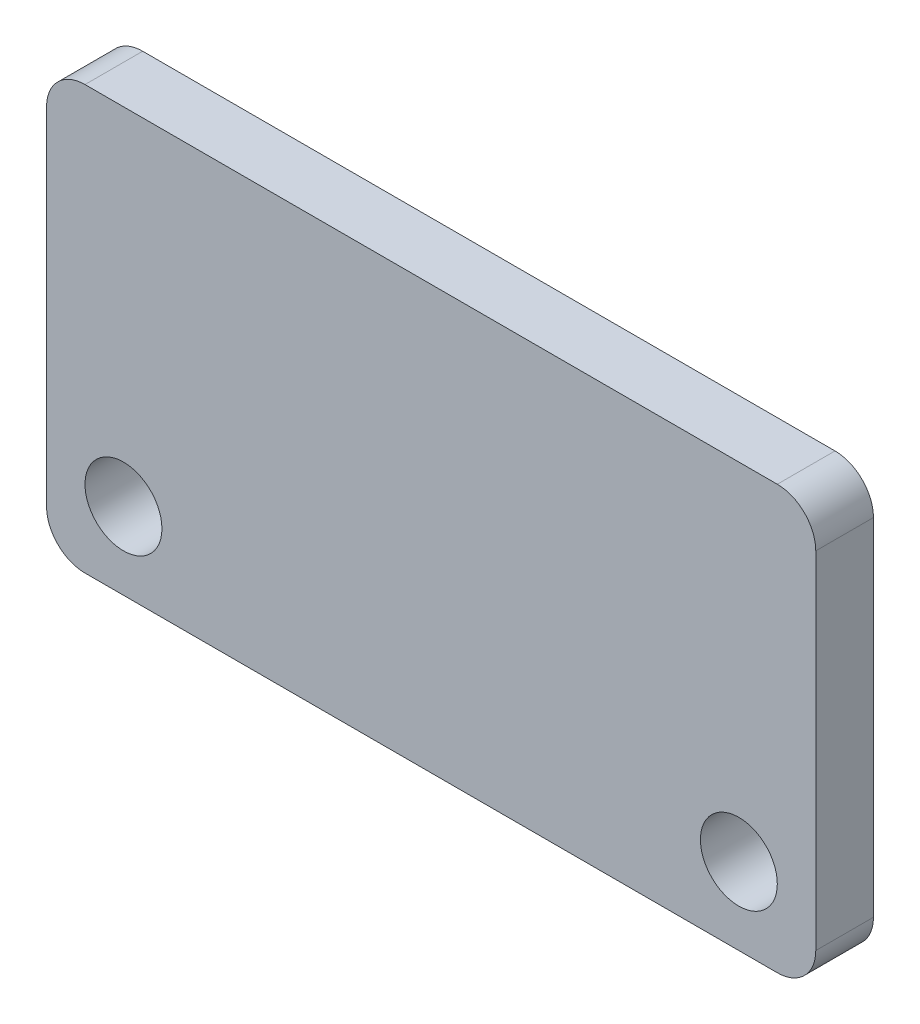
ISO-10303-21;
HEADER;
FILE_DESCRIPTION(('STEP AP214'),'2;1');
FILE_NAME('part.step','',(''),(''),'','','');
FILE_SCHEMA(('AUTOMOTIVE_DESIGN { 1 0 10303 214 1 1 1 1 }'));
ENDSEC;
DATA;
#1=APPLICATION_CONTEXT('core data for automotive mechanical design processes');
#2=APPLICATION_PROTOCOL_DEFINITION('international standard','automotive_design',2000,#1);
#3=PRODUCT_CONTEXT('',#1,'mechanical');
#4=PRODUCT('Part','Part','',(#3));
#5=PRODUCT_RELATED_PRODUCT_CATEGORY('part','',(#4));
#6=PRODUCT_DEFINITION_FORMATION('','',#4);
#7=PRODUCT_DEFINITION_CONTEXT('part definition',#1,'design');
#8=PRODUCT_DEFINITION('design','',#6,#7);
#9=PRODUCT_DEFINITION_SHAPE('','',#8);
#10=(LENGTH_UNIT() NAMED_UNIT(*) SI_UNIT(.MILLI.,.METRE.));
#11=(NAMED_UNIT(*) PLANE_ANGLE_UNIT() SI_UNIT($,.RADIAN.));
#12=(NAMED_UNIT(*) SI_UNIT($,.STERADIAN.) SOLID_ANGLE_UNIT());
#13=UNCERTAINTY_MEASURE_WITH_UNIT(LENGTH_MEASURE(1.E-05),#10,'distance_accuracy_value','');
#14=(GEOMETRIC_REPRESENTATION_CONTEXT(3) GLOBAL_UNCERTAINTY_ASSIGNED_CONTEXT((#13)) GLOBAL_UNIT_ASSIGNED_CONTEXT((#10,
#11,#12)) REPRESENTATION_CONTEXT('',''));
#15=CARTESIAN_POINT('',(0.,0.,0.));
#16=DIRECTION('',(0.,0.,1.));
#17=DIRECTION('',(1.,0.,0.));
#18=AXIS2_PLACEMENT_3D('',#15,#16,#17);
#19=CARTESIAN_POINT('',(10.,5.5,1.5));
#20=DIRECTION('',(-1.,0.,0.));
#21=DIRECTION('',(0.,0.,1.));
#22=AXIS2_PLACEMENT_3D('',#19,#20,#21);
#23=PLANE('',#22);
#24=DIRECTION('',(0.,1.,0.));
#25=VECTOR('',#24,1.);
#26=CARTESIAN_POINT('',(10.,5.5,1.5));
#27=LINE('',#26,#25);
#28=CARTESIAN_POINT('',(10.,-4.5,1.5));
#29=VERTEX_POINT('',#28);
#30=CARTESIAN_POINT('',(10.,4.5,1.5));
#31=VERTEX_POINT('',#30);
#32=EDGE_CURVE('E119',#29,#31,#27,.T.);
#33=ORIENTED_EDGE('',*,*,#32,.F.);
#34=DIRECTION('',(0.,0.,-1.));
#35=VECTOR('',#34,1.);
#36=CARTESIAN_POINT('',(10.,-4.5,1.5));
#37=LINE('',#36,#35);
#38=CARTESIAN_POINT('',(10.,-4.5,0.));
#39=VERTEX_POINT('',#38);
#40=EDGE_CURVE('E104',#29,#39,#37,.T.);
#41=ORIENTED_EDGE('',*,*,#40,.T.);
#42=DIRECTION('',(0.,1.,0.));
#43=VECTOR('',#42,1.);
#44=CARTESIAN_POINT('',(10.,5.5,0.));
#45=LINE('',#44,#43);
#46=CARTESIAN_POINT('',(10.,4.5,0.));
#47=VERTEX_POINT('',#46);
#48=EDGE_CURVE('E116',#39,#47,#45,.T.);
#49=ORIENTED_EDGE('',*,*,#48,.T.);
#50=DIRECTION('',(0.,0.,-1.));
#51=VECTOR('',#50,1.);
#52=CARTESIAN_POINT('',(10.,4.5,1.5));
#53=LINE('',#52,#51);
#54=EDGE_CURVE('E121',#47,#31,#53,.F.);
#55=ORIENTED_EDGE('',*,*,#54,.T.);
#56=EDGE_LOOP('',(#33,#41,#49,#55));
#57=FACE_BOUND('',#56,.T.);
#58=ADVANCED_FACE('F33',(#57),#23,.F.);
#59=CARTESIAN_POINT('',(-10.,5.5,1.5));
#60=DIRECTION('',(0.,-1.,0.));
#61=DIRECTION('',(0.,0.,-1.));
#62=AXIS2_PLACEMENT_3D('',#59,#60,#61);
#63=PLANE('',#62);
#64=DIRECTION('',(-1.,0.,0.));
#65=VECTOR('',#64,1.);
#66=CARTESIAN_POINT('',(-10.,5.5,0.));
#67=LINE('',#66,#65);
#68=CARTESIAN_POINT('',(9.,5.5,0.));
#69=VERTEX_POINT('',#68);
#70=CARTESIAN_POINT('',(-9.,5.5,0.));
#71=VERTEX_POINT('',#70);
#72=EDGE_CURVE('E126',#69,#71,#67,.T.);
#73=ORIENTED_EDGE('',*,*,#72,.T.);
#74=DIRECTION('',(0.,0.,-1.));
#75=VECTOR('',#74,1.);
#76=CARTESIAN_POINT('',(-9.,5.5,1.5));
#77=LINE('',#76,#75);
#78=CARTESIAN_POINT('',(-9.,5.5,1.5));
#79=VERTEX_POINT('',#78);
#80=EDGE_CURVE('E11',#71,#79,#77,.F.);
#81=ORIENTED_EDGE('',*,*,#80,.T.);
#82=DIRECTION('',(-1.,0.,0.));
#83=VECTOR('',#82,1.);
#84=CARTESIAN_POINT('',(-10.,5.5,1.5));
#85=LINE('',#84,#83);
#86=CARTESIAN_POINT('',(9.,5.5,1.5));
#87=VERTEX_POINT('',#86);
#88=EDGE_CURVE('E166',#87,#79,#85,.T.);
#89=ORIENTED_EDGE('',*,*,#88,.F.);
#90=DIRECTION('',(0.,0.,-1.));
#91=VECTOR('',#90,1.);
#92=CARTESIAN_POINT('',(9.,5.5,1.5));
#93=LINE('',#92,#91);
#94=EDGE_CURVE('E42',#87,#69,#93,.T.);
#95=ORIENTED_EDGE('',*,*,#94,.T.);
#96=EDGE_LOOP('',(#73,#81,#89,#95));
#97=FACE_BOUND('',#96,.T.);
#98=ADVANCED_FACE('F164',(#97),#63,.F.);
#99=CARTESIAN_POINT('',(-10.,5.5,1.5));
#100=DIRECTION('',(1.,0.,0.));
#101=DIRECTION('',(0.,1.,0.));
#102=AXIS2_PLACEMENT_3D('',#99,#100,#101);
#103=PLANE('',#102);
#104=DIRECTION('',(0.,-1.,0.));
#105=VECTOR('',#104,1.);
#106=CARTESIAN_POINT('',(-10.,5.5,1.5));
#107=LINE('',#106,#105);
#108=CARTESIAN_POINT('',(-10.,4.5,1.5));
#109=VERTEX_POINT('',#108);
#110=CARTESIAN_POINT('',(-10.,-4.5,1.5));
#111=VERTEX_POINT('',#110);
#112=EDGE_CURVE('E174',#109,#111,#107,.T.);
#113=ORIENTED_EDGE('',*,*,#112,.F.);
#114=DIRECTION('',(0.,0.,-1.));
#115=VECTOR('',#114,1.);
#116=CARTESIAN_POINT('',(-10.,4.5,1.5));
#117=LINE('',#116,#115);
#118=CARTESIAN_POINT('',(-10.,4.5,0.));
#119=VERTEX_POINT('',#118);
#120=EDGE_CURVE('E157',#109,#119,#117,.T.);
#121=ORIENTED_EDGE('',*,*,#120,.T.);
#122=DIRECTION('',(0.,-1.,0.));
#123=VECTOR('',#122,1.);
#124=CARTESIAN_POINT('',(-10.,5.5,0.));
#125=LINE('',#124,#123);
#126=CARTESIAN_POINT('',(-10.,-4.5,0.));
#127=VERTEX_POINT('',#126);
#128=EDGE_CURVE('E130',#119,#127,#125,.T.);
#129=ORIENTED_EDGE('',*,*,#128,.T.);
#130=DIRECTION('',(0.,0.,-1.));
#131=VECTOR('',#130,1.);
#132=CARTESIAN_POINT('',(-10.,-4.5,1.5));
#133=LINE('',#132,#131);
#134=EDGE_CURVE('E49',#127,#111,#133,.F.);
#135=ORIENTED_EDGE('',*,*,#134,.T.);
#136=EDGE_LOOP('',(#113,#121,#129,#135));
#137=FACE_BOUND('',#136,.T.);
#138=ADVANCED_FACE('F173',(#137),#103,.F.);
#139=CARTESIAN_POINT('',(-10.,-5.5,1.5));
#140=DIRECTION('',(0.,1.,0.));
#141=DIRECTION('',(0.,0.,1.));
#142=AXIS2_PLACEMENT_3D('',#139,#140,#141);
#143=PLANE('',#142);
#144=DIRECTION('',(1.,0.,0.));
#145=VECTOR('',#144,1.);
#146=CARTESIAN_POINT('',(-10.,-5.5,0.));
#147=LINE('',#146,#145);
#148=CARTESIAN_POINT('',(-9.,-5.5,0.));
#149=VERTEX_POINT('',#148);
#150=CARTESIAN_POINT('',(9.,-5.5,0.));
#151=VERTEX_POINT('',#150);
#152=EDGE_CURVE('E140',#149,#151,#147,.T.);
#153=ORIENTED_EDGE('',*,*,#152,.T.);
#154=DIRECTION('',(0.,0.,-1.));
#155=VECTOR('',#154,1.);
#156=CARTESIAN_POINT('',(9.,-5.5,1.5));
#157=LINE('',#156,#155);
#158=CARTESIAN_POINT('',(9.,-5.5,1.5));
#159=VERTEX_POINT('',#158);
#160=EDGE_CURVE('E105',#151,#159,#157,.F.);
#161=ORIENTED_EDGE('',*,*,#160,.T.);
#162=DIRECTION('',(1.,0.,0.));
#163=VECTOR('',#162,1.);
#164=CARTESIAN_POINT('',(-10.,-5.5,1.5));
#165=LINE('',#164,#163);
#166=CARTESIAN_POINT('',(-9.,-5.5,1.5));
#167=VERTEX_POINT('',#166);
#168=EDGE_CURVE('E136',#167,#159,#165,.T.);
#169=ORIENTED_EDGE('',*,*,#168,.F.);
#170=DIRECTION('',(0.,0.,-1.));
#171=VECTOR('',#170,1.);
#172=CARTESIAN_POINT('',(-9.,-5.5,1.5));
#173=LINE('',#172,#171);
#174=EDGE_CURVE('E110',#167,#149,#173,.T.);
#175=ORIENTED_EDGE('',*,*,#174,.T.);
#176=EDGE_LOOP('',(#153,#161,#169,#175));
#177=FACE_BOUND('',#176,.T.);
#178=ADVANCED_FACE('F221',(#177),#143,.F.);
#179=CARTESIAN_POINT('',(0.,0.,1.5));
#180=DIRECTION('',(0.,0.,1.));
#181=DIRECTION('',(1.,0.,0.));
#182=AXIS2_PLACEMENT_3D('',#179,#180,#181);
#183=PLANE('',#182);
#184=CARTESIAN_POINT('',(-8.,-3.5,1.5));
#185=DIRECTION('',(0.,0.,1.));
#186=DIRECTION('',(1.,0.,0.));
#187=AXIS2_PLACEMENT_3D('',#184,#185,#186);
#188=CIRCLE('',#187,1.);
#189=CARTESIAN_POINT('',(-7.,-3.5,1.5));
#190=VERTEX_POINT('',#189);
#191=EDGE_CURVE('E182',#190,#190,#188,.T.);
#192=ORIENTED_EDGE('',*,*,#191,.F.);
#193=EDGE_LOOP('',(#192));
#194=FACE_BOUND('',#193,.T.);
#195=CARTESIAN_POINT('',(8.,-3.5,1.5));
#196=DIRECTION('',(0.,0.,1.));
#197=DIRECTION('',(1.,0.,0.));
#198=AXIS2_PLACEMENT_3D('',#195,#196,#197);
#199=CIRCLE('',#198,0.999999999999999);
#200=CARTESIAN_POINT('',(9.,-3.5,1.5));
#201=VERTEX_POINT('',#200);
#202=EDGE_CURVE('E133',#201,#201,#199,.T.);
#203=ORIENTED_EDGE('',*,*,#202,.F.);
#204=EDGE_LOOP('',(#203));
#205=FACE_BOUND('',#204,.T.);
#206=ORIENTED_EDGE('',*,*,#168,.T.);
#207=CARTESIAN_POINT('',(9.,-4.5,1.5));
#208=DIRECTION('',(0.,0.,1.));
#209=DIRECTION('',(1.,0.,0.));
#210=AXIS2_PLACEMENT_3D('',#207,#208,#209);
#211=CIRCLE('',#210,1.);
#212=EDGE_CURVE('E154',#159,#29,#211,.T.);
#213=ORIENTED_EDGE('',*,*,#212,.T.);
#214=ORIENTED_EDGE('',*,*,#32,.T.);
#215=CARTESIAN_POINT('',(9.,4.5,1.5));
#216=DIRECTION('',(0.,0.,1.));
#217=DIRECTION('',(1.,0.,0.));
#218=AXIS2_PLACEMENT_3D('',#215,#216,#217);
#219=CIRCLE('',#218,1.);
#220=EDGE_CURVE('E151',#31,#87,#219,.T.);
#221=ORIENTED_EDGE('',*,*,#220,.T.);
#222=ORIENTED_EDGE('',*,*,#88,.T.);
#223=CARTESIAN_POINT('',(-9.,4.5,1.5));
#224=DIRECTION('',(0.,0.,1.));
#225=DIRECTION('',(1.,0.,0.));
#226=AXIS2_PLACEMENT_3D('',#223,#224,#225);
#227=CIRCLE('',#226,1.);
#228=EDGE_CURVE('E56',#79,#109,#227,.T.);
#229=ORIENTED_EDGE('',*,*,#228,.T.);
#230=ORIENTED_EDGE('',*,*,#112,.T.);
#231=CARTESIAN_POINT('',(-9.,-4.5,1.5));
#232=DIRECTION('',(0.,0.,1.));
#233=DIRECTION('',(1.,0.,0.));
#234=AXIS2_PLACEMENT_3D('',#231,#232,#233);
#235=CIRCLE('',#234,1.);
#236=EDGE_CURVE('E149',#111,#167,#235,.T.);
#237=ORIENTED_EDGE('',*,*,#236,.T.);
#238=EDGE_LOOP('',(#206,#213,#214,#221,#222,#229,#230,#237));
#239=FACE_BOUND('',#238,.T.);
#240=ADVANCED_FACE('F217',(#194,#205,#239),#183,.T.);
#241=CARTESIAN_POINT('',(0.,0.,0.));
#242=DIRECTION('',(0.,0.,1.));
#243=DIRECTION('',(1.,0.,0.));
#244=AXIS2_PLACEMENT_3D('',#241,#242,#243);
#245=PLANE('',#244);
#246=CARTESIAN_POINT('',(-8.,-3.5,0.));
#247=DIRECTION('',(0.,0.,1.));
#248=DIRECTION('',(1.,0.,0.));
#249=AXIS2_PLACEMENT_3D('',#246,#247,#248);
#250=CIRCLE('',#249,1.);
#251=CARTESIAN_POINT('',(-7.,-3.5,0.));
#252=VERTEX_POINT('',#251);
#253=EDGE_CURVE('E37',#252,#252,#250,.T.);
#254=ORIENTED_EDGE('',*,*,#253,.T.);
#255=EDGE_LOOP('',(#254));
#256=FACE_BOUND('',#255,.T.);
#257=CARTESIAN_POINT('',(8.,-3.5,0.));
#258=DIRECTION('',(0.,0.,1.));
#259=DIRECTION('',(1.,0.,0.));
#260=AXIS2_PLACEMENT_3D('',#257,#258,#259);
#261=CIRCLE('',#260,0.999999999999999);
#262=CARTESIAN_POINT('',(9.,-3.5,0.));
#263=VERTEX_POINT('',#262);
#264=EDGE_CURVE('E127',#263,#263,#261,.T.);
#265=ORIENTED_EDGE('',*,*,#264,.T.);
#266=EDGE_LOOP('',(#265));
#267=FACE_BOUND('',#266,.T.);
#268=ORIENTED_EDGE('',*,*,#48,.F.);
#269=CARTESIAN_POINT('',(9.,-4.5,0.));
#270=DIRECTION('',(0.,0.,1.));
#271=DIRECTION('',(1.,0.,0.));
#272=AXIS2_PLACEMENT_3D('',#269,#270,#271);
#273=CIRCLE('',#272,1.);
#274=EDGE_CURVE('E100',#39,#151,#273,.F.);
#275=ORIENTED_EDGE('',*,*,#274,.T.);
#276=ORIENTED_EDGE('',*,*,#152,.F.);
#277=CARTESIAN_POINT('',(-9.,-4.5,0.));
#278=DIRECTION('',(0.,0.,1.));
#279=DIRECTION('',(1.,0.,0.));
#280=AXIS2_PLACEMENT_3D('',#277,#278,#279);
#281=CIRCLE('',#280,1.);
#282=EDGE_CURVE('E120',#149,#127,#281,.F.);
#283=ORIENTED_EDGE('',*,*,#282,.T.);
#284=ORIENTED_EDGE('',*,*,#128,.F.);
#285=CARTESIAN_POINT('',(-9.,4.5,0.));
#286=DIRECTION('',(0.,0.,1.));
#287=DIRECTION('',(1.,0.,0.));
#288=AXIS2_PLACEMENT_3D('',#285,#286,#287);
#289=CIRCLE('',#288,1.);
#290=EDGE_CURVE('E111',#119,#71,#289,.F.);
#291=ORIENTED_EDGE('',*,*,#290,.T.);
#292=ORIENTED_EDGE('',*,*,#72,.F.);
#293=CARTESIAN_POINT('',(9.,4.5,0.));
#294=DIRECTION('',(0.,0.,1.));
#295=DIRECTION('',(1.,0.,0.));
#296=AXIS2_PLACEMENT_3D('',#293,#294,#295);
#297=CIRCLE('',#296,1.);
#298=EDGE_CURVE('E125',#69,#47,#297,.F.);
#299=ORIENTED_EDGE('',*,*,#298,.T.);
#300=EDGE_LOOP('',(#268,#275,#276,#283,#284,#291,#292,#299));
#301=FACE_BOUND('',#300,.T.);
#302=ADVANCED_FACE('F123',(#256,#267,#301),#245,.F.);
#303=CARTESIAN_POINT('',(9.,-4.5,1.5));
#304=DIRECTION('',(0.,0.,-1.));
#305=DIRECTION('',(-1.,0.,0.));
#306=AXIS2_PLACEMENT_3D('',#303,#304,#305);
#307=CYLINDRICAL_SURFACE('',#306,1.);
#308=ORIENTED_EDGE('',*,*,#212,.F.);
#309=ORIENTED_EDGE('',*,*,#160,.F.);
#310=ORIENTED_EDGE('',*,*,#274,.F.);
#311=ORIENTED_EDGE('',*,*,#40,.F.);
#312=EDGE_LOOP('',(#308,#309,#310,#311));
#313=FACE_BOUND('',#312,.T.);
#314=ADVANCED_FACE('F103',(#313),#307,.T.);
#315=CARTESIAN_POINT('',(-9.,4.5,1.5));
#316=DIRECTION('',(0.,0.,-1.));
#317=DIRECTION('',(-1.,0.,0.));
#318=AXIS2_PLACEMENT_3D('',#315,#316,#317);
#319=CYLINDRICAL_SURFACE('',#318,1.);
#320=ORIENTED_EDGE('',*,*,#228,.F.);
#321=ORIENTED_EDGE('',*,*,#80,.F.);
#322=ORIENTED_EDGE('',*,*,#290,.F.);
#323=ORIENTED_EDGE('',*,*,#120,.F.);
#324=EDGE_LOOP('',(#320,#321,#322,#323));
#325=FACE_BOUND('',#324,.T.);
#326=ADVANCED_FACE('F172',(#325),#319,.T.);
#327=CARTESIAN_POINT('',(9.,4.5,1.5));
#328=DIRECTION('',(0.,0.,-1.));
#329=DIRECTION('',(-1.,0.,0.));
#330=AXIS2_PLACEMENT_3D('',#327,#328,#329);
#331=CYLINDRICAL_SURFACE('',#330,1.);
#332=ORIENTED_EDGE('',*,*,#220,.F.);
#333=ORIENTED_EDGE('',*,*,#54,.F.);
#334=ORIENTED_EDGE('',*,*,#298,.F.);
#335=ORIENTED_EDGE('',*,*,#94,.F.);
#336=EDGE_LOOP('',(#332,#333,#334,#335));
#337=FACE_BOUND('',#336,.T.);
#338=ADVANCED_FACE('F211',(#337),#331,.T.);
#339=CARTESIAN_POINT('',(-9.,-4.5,1.5));
#340=DIRECTION('',(0.,0.,-1.));
#341=DIRECTION('',(-1.,0.,0.));
#342=AXIS2_PLACEMENT_3D('',#339,#340,#341);
#343=CYLINDRICAL_SURFACE('',#342,1.);
#344=ORIENTED_EDGE('',*,*,#236,.F.);
#345=ORIENTED_EDGE('',*,*,#134,.F.);
#346=ORIENTED_EDGE('',*,*,#282,.F.);
#347=ORIENTED_EDGE('',*,*,#174,.F.);
#348=EDGE_LOOP('',(#344,#345,#346,#347));
#349=FACE_BOUND('',#348,.T.);
#350=ADVANCED_FACE('F35',(#349),#343,.T.);
#351=CARTESIAN_POINT('',(8.,-3.5,1.5));
#352=DIRECTION('',(0.,0.,1.));
#353=DIRECTION('',(1.,0.,0.));
#354=AXIS2_PLACEMENT_3D('',#351,#352,#353);
#355=CYLINDRICAL_SURFACE('',#354,0.999999999999999);
#356=ORIENTED_EDGE('',*,*,#202,.T.);
#357=EDGE_LOOP('',(#356));
#358=FACE_BOUND('',#357,.T.);
#359=ORIENTED_EDGE('',*,*,#264,.F.);
#360=EDGE_LOOP('',(#359));
#361=FACE_BOUND('',#360,.T.);
#362=ADVANCED_FACE('F193',(#358,#361),#355,.F.);
#363=CARTESIAN_POINT('',(-8.,-3.5,1.5));
#364=DIRECTION('',(0.,0.,1.));
#365=DIRECTION('',(1.,0.,0.));
#366=AXIS2_PLACEMENT_3D('',#363,#364,#365);
#367=CYLINDRICAL_SURFACE('',#366,1.);
#368=ORIENTED_EDGE('',*,*,#191,.T.);
#369=EDGE_LOOP('',(#368));
#370=FACE_BOUND('',#369,.T.);
#371=ORIENTED_EDGE('',*,*,#253,.F.);
#372=EDGE_LOOP('',(#371));
#373=FACE_BOUND('',#372,.T.);
#374=ADVANCED_FACE('F191',(#370,#373),#367,.F.);
#375=CLOSED_SHELL('',(#58,#98,#138,#178,#240,#302,#314,#326,#338,#350,#362,#374));
#376=MANIFOLD_SOLID_BREP('B2',#375);
#377=ADVANCED_BREP_SHAPE_REPRESENTATION('',(#18,#376),#14);
#378=SHAPE_DEFINITION_REPRESENTATION(#9,#377);
ENDSEC;
END-ISO-10303-21;
